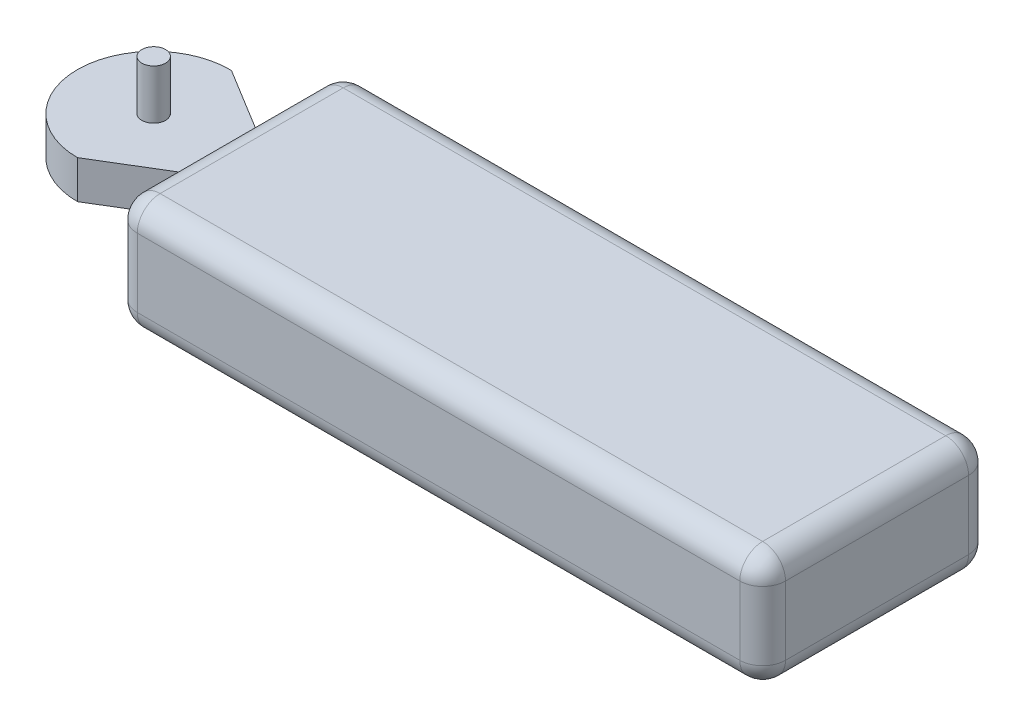
ISO-10303-21;
HEADER;
FILE_DESCRIPTION(('STEP AP214'),'2;1');
FILE_NAME('part.step','',(''),(''),'','','');
FILE_SCHEMA(('AUTOMOTIVE_DESIGN { 1 0 10303 214 1 1 1 1 }'));
ENDSEC;
DATA;
#1=APPLICATION_CONTEXT('core data for automotive mechanical design processes');
#2=APPLICATION_PROTOCOL_DEFINITION('international standard','automotive_design',2000,#1);
#3=PRODUCT_CONTEXT('',#1,'mechanical');
#4=PRODUCT('Part','Part','',(#3));
#5=PRODUCT_RELATED_PRODUCT_CATEGORY('part','',(#4));
#6=PRODUCT_DEFINITION_FORMATION('','',#4);
#7=PRODUCT_DEFINITION_CONTEXT('part definition',#1,'design');
#8=PRODUCT_DEFINITION('design','',#6,#7);
#9=PRODUCT_DEFINITION_SHAPE('','',#8);
#10=(LENGTH_UNIT() NAMED_UNIT(*) SI_UNIT(.MILLI.,.METRE.));
#11=(NAMED_UNIT(*) PLANE_ANGLE_UNIT() SI_UNIT($,.RADIAN.));
#12=(NAMED_UNIT(*) SI_UNIT($,.STERADIAN.) SOLID_ANGLE_UNIT());
#13=UNCERTAINTY_MEASURE_WITH_UNIT(LENGTH_MEASURE(1.E-05),#10,'distance_accuracy_value','');
#14=(GEOMETRIC_REPRESENTATION_CONTEXT(3) GLOBAL_UNCERTAINTY_ASSIGNED_CONTEXT((#13)) GLOBAL_UNIT_ASSIGNED_CONTEXT((#10,
#11,#12)) REPRESENTATION_CONTEXT('',''));
#15=CARTESIAN_POINT('',(0.,0.,0.));
#16=DIRECTION('',(0.,0.,1.));
#17=DIRECTION('',(1.,0.,0.));
#18=AXIS2_PLACEMENT_3D('',#15,#16,#17);
#19=CARTESIAN_POINT('',(0.,5.,0.));
#20=DIRECTION('',(0.,1.,0.));
#21=DIRECTION('',(0.,0.,1.));
#22=AXIS2_PLACEMENT_3D('',#19,#20,#21);
#23=PLANE('',#22);
#24=CARTESIAN_POINT('',(-5.69083513362976,5.,-2.99239543726236));
#25=DIRECTION('',(0.,1.,0.));
#26=DIRECTION('',(0.,0.,1.));
#27=AXIS2_PLACEMENT_3D('',#24,#25,#26);
#28=CIRCLE('',#27,1.55);
#29=CARTESIAN_POINT('',(-5.69083513362976,5.,-1.44239543726236));
#30=VERTEX_POINT('',#29);
#31=EDGE_CURVE('E328',#30,#30,#28,.T.);
#32=ORIENTED_EDGE('',*,*,#31,.F.);
#33=EDGE_LOOP('',(#32));
#34=FACE_BOUND('',#33,.T.);
#35=DIRECTION('',(0.,0.,-1.));
#36=VECTOR('',#35,1.);
#37=CARTESIAN_POINT('',(4.30916486637024,5.,-13.9923954372624));
#38=LINE('',#37,#36);
#39=CARTESIAN_POINT('',(4.30916486637024,5.,8.00760456273764));
#40=VERTEX_POINT('',#39);
#41=CARTESIAN_POINT('',(4.30916486637024,5.,-13.9923954372624));
#42=VERTEX_POINT('',#41);
#43=EDGE_CURVE('E338',#40,#42,#38,.T.);
#44=ORIENTED_EDGE('',*,*,#43,.T.);
#45=DIRECTION('',(-0.00427873727129613,0.,0.999990846161785));
#46=VECTOR('',#45,1.);
#47=CARTESIAN_POINT('',(4.24921674010145,5.,0.0181814484697253));
#48=LINE('',#47,#46);
#49=CARTESIAN_POINT('',(4.27929159000259,5.,-7.0106620382737));
#50=VERTEX_POINT('',#49);
#51=EDGE_CURVE('E182',#42,#50,#48,.T.);
#52=ORIENTED_EDGE('',*,*,#51,.T.);
#53=DIRECTION('',(0.853145713135539,0.,0.521672686805101));
#54=VECTOR('',#53,1.);
#55=CARTESIAN_POINT('',(4.28476164168329,5.,-7.00731726783965));
#56=LINE('',#55,#54);
#57=CARTESIAN_POINT('',(-5.50029135492208,5.,-12.9905799258781));
#58=VERTEX_POINT('',#57);
#59=EDGE_CURVE('E190',#58,#50,#56,.T.);
#60=ORIENTED_EDGE('',*,*,#59,.F.);
#61=CARTESIAN_POINT('',(-5.69083513362976,5.,-2.99239543726236));
#62=DIRECTION('',(0.,1.,0.));
#63=DIRECTION('',(0.,0.,1.));
#64=AXIS2_PLACEMENT_3D('',#61,#62,#63);
#65=CIRCLE('',#64,10.);
#66=CARTESIAN_POINT('',(-5.69083513362976,5.,7.00760456273764));
#67=VERTEX_POINT('',#66);
#68=EDGE_CURVE('E353',#58,#67,#65,.T.);
#69=ORIENTED_EDGE('',*,*,#68,.T.);
#70=DIRECTION('',(0.855333889667035,0.,-0.518077153701127));
#71=VECTOR('',#70,1.);
#72=CARTESIAN_POINT('',(1.57782987528949,5.,2.60496212740307));
#73=LINE('',#72,#71);
#74=CARTESIAN_POINT('',(4.21503178472273,5.,1.00760456273764));
#75=VERTEX_POINT('',#74);
#76=EDGE_CURVE('E356',#67,#75,#73,.T.);
#77=ORIENTED_EDGE('',*,*,#76,.T.);
#78=DIRECTION('',(0.,0.,1.));
#79=VECTOR('',#78,1.);
#80=CARTESIAN_POINT('',(4.21503178472273,5.,0.));
#81=LINE('',#80,#79);
#82=CARTESIAN_POINT('',(4.21503178472273,5.,8.00760456273764));
#83=VERTEX_POINT('',#82);
#84=EDGE_CURVE('E359',#75,#83,#81,.T.);
#85=ORIENTED_EDGE('',*,*,#84,.T.);
#86=DIRECTION('',(1.,0.,0.));
#87=VECTOR('',#86,1.);
#88=CARTESIAN_POINT('',(-15.6908351336298,5.,8.00760456273764));
#89=LINE('',#88,#87);
#90=EDGE_CURVE('E341',#83,#40,#89,.T.);
#91=ORIENTED_EDGE('',*,*,#90,.T.);
#92=EDGE_LOOP('',(#44,#52,#60,#69,#77,#85,#91));
#93=FACE_BOUND('',#92,.T.);
#94=ADVANCED_FACE('F39',(#34,#93),#23,.T.);
#95=CARTESIAN_POINT('',(0.,0.,0.));
#96=DIRECTION('',(0.,1.,0.));
#97=DIRECTION('',(0.,0.,1.));
#98=AXIS2_PLACEMENT_3D('',#95,#96,#97);
#99=PLANE('',#98);
#100=CARTESIAN_POINT('',(-5.69083513362976,0.,-2.99239543726236));
#101=DIRECTION('',(0.,1.,0.));
#102=DIRECTION('',(0.,0.,1.));
#103=AXIS2_PLACEMENT_3D('',#100,#101,#102);
#104=CIRCLE('',#103,1.55);
#105=CARTESIAN_POINT('',(-5.69083513362976,0.,-1.44239543726236));
#106=VERTEX_POINT('',#105);
#107=EDGE_CURVE('E329',#106,#106,#104,.T.);
#108=ORIENTED_EDGE('',*,*,#107,.T.);
#109=EDGE_LOOP('',(#108));
#110=FACE_BOUND('',#109,.T.);
#111=DIRECTION('',(-0.00427873727129613,0.,0.999990846161785));
#112=VECTOR('',#111,1.);
#113=CARTESIAN_POINT('',(4.24921674010145,0.,0.0181814484697253));
#114=LINE('',#113,#112);
#115=CARTESIAN_POINT('',(4.30916486637024,0.,-13.9923954372624));
#116=VERTEX_POINT('',#115);
#117=CARTESIAN_POINT('',(4.27929159000259,0.,-7.0106620382737));
#118=VERTEX_POINT('',#117);
#119=EDGE_CURVE('E172',#116,#118,#114,.T.);
#120=ORIENTED_EDGE('',*,*,#119,.F.);
#121=DIRECTION('',(0.,0.,-1.));
#122=VECTOR('',#121,1.);
#123=CARTESIAN_POINT('',(4.30916486637024,0.,-13.9923954372624));
#124=LINE('',#123,#122);
#125=CARTESIAN_POINT('',(4.30916486637024,0.,8.00760456273764));
#126=VERTEX_POINT('',#125);
#127=EDGE_CURVE('E339',#126,#116,#124,.T.);
#128=ORIENTED_EDGE('',*,*,#127,.F.);
#129=DIRECTION('',(1.,0.,0.));
#130=VECTOR('',#129,1.);
#131=CARTESIAN_POINT('',(-15.6908351336298,0.,8.00760456273764));
#132=LINE('',#131,#130);
#133=CARTESIAN_POINT('',(4.21503178472273,0.,8.00760456273764));
#134=VERTEX_POINT('',#133);
#135=EDGE_CURVE('E332',#134,#126,#132,.T.);
#136=ORIENTED_EDGE('',*,*,#135,.F.);
#137=DIRECTION('',(0.,0.,1.));
#138=VECTOR('',#137,1.);
#139=CARTESIAN_POINT('',(4.21503178472273,0.,0.));
#140=LINE('',#139,#138);
#141=CARTESIAN_POINT('',(4.21503178472273,0.,1.00760456273764));
#142=VERTEX_POINT('',#141);
#143=EDGE_CURVE('E200',#142,#134,#140,.T.);
#144=ORIENTED_EDGE('',*,*,#143,.F.);
#145=DIRECTION('',(0.855333889667035,0.,-0.518077153701127));
#146=VECTOR('',#145,1.);
#147=CARTESIAN_POINT('',(1.57782987528949,0.,2.60496212740307));
#148=LINE('',#147,#146);
#149=CARTESIAN_POINT('',(-5.69083513362976,0.,7.00760456273764));
#150=VERTEX_POINT('',#149);
#151=EDGE_CURVE('E196',#150,#142,#148,.T.);
#152=ORIENTED_EDGE('',*,*,#151,.F.);
#153=CARTESIAN_POINT('',(-5.69083513362976,0.,-2.99239543726236));
#154=DIRECTION('',(0.,1.,0.));
#155=DIRECTION('',(0.,0.,1.));
#156=AXIS2_PLACEMENT_3D('',#153,#154,#155);
#157=CIRCLE('',#156,10.);
#158=CARTESIAN_POINT('',(-5.50029135492208,0.,-12.9905799258781));
#159=VERTEX_POINT('',#158);
#160=EDGE_CURVE('E47',#159,#150,#157,.T.);
#161=ORIENTED_EDGE('',*,*,#160,.F.);
#162=DIRECTION('',(0.853145713135539,0.,0.521672686805101));
#163=VECTOR('',#162,1.);
#164=CARTESIAN_POINT('',(4.28476164168329,0.,-7.00731726783965));
#165=LINE('',#164,#163);
#166=EDGE_CURVE('E11',#159,#118,#165,.T.);
#167=ORIENTED_EDGE('',*,*,#166,.T.);
#168=EDGE_LOOP('',(#120,#128,#136,#144,#152,#161,#167));
#169=FACE_BOUND('',#168,.T.);
#170=ADVANCED_FACE('F193',(#110,#169),#99,.F.);
#171=CARTESIAN_POINT('',(-15.6908351336298,5.,8.00760456273764));
#172=DIRECTION('',(0.,0.,-1.));
#173=DIRECTION('',(-1.,0.,0.));
#174=AXIS2_PLACEMENT_3D('',#171,#172,#173);
#175=PLANE('',#174);
#176=DIRECTION('',(0.,1.,0.));
#177=VECTOR('',#176,1.);
#178=CARTESIAN_POINT('',(4.21503178472273,-8.5,8.00760456273764));
#179=LINE('',#178,#177);
#180=EDGE_CURVE('E363',#134,#83,#179,.T.);
#181=ORIENTED_EDGE('',*,*,#180,.F.);
#182=ORIENTED_EDGE('',*,*,#135,.T.);
#183=DIRECTION('',(0.,-1.,0.));
#184=VECTOR('',#183,1.);
#185=CARTESIAN_POINT('',(4.30916486637024,5.,8.00760456273764));
#186=LINE('',#185,#184);
#187=EDGE_CURVE('E334',#40,#126,#186,.T.);
#188=ORIENTED_EDGE('',*,*,#187,.F.);
#189=ORIENTED_EDGE('',*,*,#90,.F.);
#190=EDGE_LOOP('',(#181,#182,#188,#189));
#191=FACE_BOUND('',#190,.T.);
#192=ADVANCED_FACE('F379',(#191),#175,.F.);
#193=CARTESIAN_POINT('',(7.30916486637024,0.,9.16296612584685));
#194=DIRECTION('',(0.,1.,0.));
#195=DIRECTION('',(0.,0.,1.));
#196=AXIS2_PLACEMENT_3D('',#193,#194,#195);
#197=CYLINDRICAL_SURFACE('',#196,3.);
#198=CARTESIAN_POINT('',(7.30916486637023,5.5,9.16296612584685));
#199=DIRECTION('',(0.,1.,0.));
#200=DIRECTION('',(0.,0.,1.));
#201=AXIS2_PLACEMENT_3D('',#198,#199,#200);
#202=CIRCLE('',#201,3.);
#203=CARTESIAN_POINT('',(4.30916486637024,5.5,9.16296612584685));
#204=VERTEX_POINT('',#203);
#205=CARTESIAN_POINT('',(7.30916486637023,5.5,12.1629661258468));
#206=VERTEX_POINT('',#205);
#207=EDGE_CURVE('E204',#204,#206,#202,.T.);
#208=ORIENTED_EDGE('',*,*,#207,.F.);
#209=DIRECTION('',(0.,1.,0.));
#210=VECTOR('',#209,1.);
#211=CARTESIAN_POINT('',(4.30916486637024,0.,9.16296612584685));
#212=LINE('',#211,#210);
#213=CARTESIAN_POINT('',(4.30916486637024,-3.5,9.16296612584684));
#214=VERTEX_POINT('',#213);
#215=EDGE_CURVE('E246',#214,#204,#212,.T.);
#216=ORIENTED_EDGE('',*,*,#215,.F.);
#217=CARTESIAN_POINT('',(7.30916486637023,-3.5,9.16296612584684));
#218=DIRECTION('',(0.,1.,0.));
#219=DIRECTION('',(0.,0.,1.));
#220=AXIS2_PLACEMENT_3D('',#217,#218,#219);
#221=CIRCLE('',#220,3.);
#222=CARTESIAN_POINT('',(7.30916486637023,-3.5,12.1629661258468));
#223=VERTEX_POINT('',#222);
#224=EDGE_CURVE('E62',#214,#223,#221,.T.);
#225=ORIENTED_EDGE('',*,*,#224,.T.);
#226=DIRECTION('',(0.,1.,0.));
#227=VECTOR('',#226,1.);
#228=CARTESIAN_POINT('',(7.30916486637025,8.5,12.1629661258468));
#229=LINE('',#228,#227);
#230=EDGE_CURVE('E219',#206,#223,#229,.F.);
#231=ORIENTED_EDGE('',*,*,#230,.F.);
#232=EDGE_LOOP('',(#208,#216,#225,#231));
#233=FACE_BOUND('',#232,.T.);
#234=ADVANCED_FACE('F41',(#233),#197,.T.);
#235=CARTESIAN_POINT('',(7.30916486637025,-3.5,9.16296612584685));
#236=DIRECTION('',(1.,0.,0.));
#237=DIRECTION('',(0.,0.,-1.));
#238=AXIS2_PLACEMENT_3D('',#235,#236,#237);
#239=SPHERICAL_SURFACE('',#238,3.);
#240=ORIENTED_EDGE('',*,*,#224,.F.);
#241=CARTESIAN_POINT('',(7.30916486637023,-3.5,9.16296612584685));
#242=DIRECTION('',(0.,0.,1.));
#243=DIRECTION('',(1.,0.,0.));
#244=AXIS2_PLACEMENT_3D('',#241,#242,#243);
#245=CIRCLE('',#244,3.);
#246=CARTESIAN_POINT('',(7.30916486637023,-6.5,9.16296612584685));
#247=VERTEX_POINT('',#246);
#248=EDGE_CURVE('E207',#214,#247,#245,.T.);
#249=ORIENTED_EDGE('',*,*,#248,.T.);
#250=CARTESIAN_POINT('',(7.30916486637025,-3.5,9.16296612584685));
#251=DIRECTION('',(1.,0.,0.));
#252=DIRECTION('',(0.,0.,-1.));
#253=AXIS2_PLACEMENT_3D('',#250,#251,#252);
#254=CIRCLE('',#253,3.);
#255=EDGE_CURVE('E221',#223,#247,#254,.T.);
#256=ORIENTED_EDGE('',*,*,#255,.F.);
#257=EDGE_LOOP('',(#240,#249,#256));
#258=FACE_BOUND('',#257,.T.);
#259=ADVANCED_FACE('F485',(#258),#239,.T.);
#260=CARTESIAN_POINT('',(7.30916486637024,-3.5,0.));
#261=DIRECTION('',(0.,0.,1.));
#262=DIRECTION('',(1.,0.,0.));
#263=AXIS2_PLACEMENT_3D('',#260,#261,#262);
#264=CYLINDRICAL_SURFACE('',#263,3.);
#265=ORIENTED_EDGE('',*,*,#248,.F.);
#266=DIRECTION('',(0.,0.,1.));
#267=VECTOR('',#266,1.);
#268=CARTESIAN_POINT('',(4.30916486637024,-3.5,0.));
#269=LINE('',#268,#267);
#270=CARTESIAN_POINT('',(4.30916486637024,-3.5,-14.8370338741532));
#271=VERTEX_POINT('',#270);
#272=EDGE_CURVE('E244',#271,#214,#269,.T.);
#273=ORIENTED_EDGE('',*,*,#272,.F.);
#274=CARTESIAN_POINT('',(7.30916486637023,-3.5,-14.8370338741532));
#275=DIRECTION('',(0.,0.,1.));
#276=DIRECTION('',(1.,0.,0.));
#277=AXIS2_PLACEMENT_3D('',#274,#275,#276);
#278=CIRCLE('',#277,3.);
#279=CARTESIAN_POINT('',(7.30916486637023,-6.5,-14.8370338741532));
#280=VERTEX_POINT('',#279);
#281=EDGE_CURVE('E209',#271,#280,#278,.T.);
#282=ORIENTED_EDGE('',*,*,#281,.T.);
#283=DIRECTION('',(0.,0.,1.));
#284=VECTOR('',#283,1.);
#285=CARTESIAN_POINT('',(7.30916486637025,-6.5,12.1629661258468));
#286=LINE('',#285,#284);
#287=EDGE_CURVE('E224',#247,#280,#286,.F.);
#288=ORIENTED_EDGE('',*,*,#287,.F.);
#289=EDGE_LOOP('',(#265,#273,#282,#288));
#290=FACE_BOUND('',#289,.T.);
#291=ADVANCED_FACE('F482',(#290),#264,.T.);
#292=CARTESIAN_POINT('',(7.30916486637025,-3.5,-14.8370338741532));
#293=DIRECTION('',(1.,0.,0.));
#294=DIRECTION('',(0.,0.,-1.));
#295=AXIS2_PLACEMENT_3D('',#292,#293,#294);
#296=SPHERICAL_SURFACE('',#295,3.);
#297=ORIENTED_EDGE('',*,*,#281,.F.);
#298=CARTESIAN_POINT('',(7.30916486637023,-3.5,-14.8370338741532));
#299=DIRECTION('',(0.,-1.,0.));
#300=DIRECTION('',(0.,0.,-1.));
#301=AXIS2_PLACEMENT_3D('',#298,#299,#300);
#302=CIRCLE('',#301,3.);
#303=CARTESIAN_POINT('',(7.30916486637023,-3.5,-17.8370338741532));
#304=VERTEX_POINT('',#303);
#305=EDGE_CURVE('E211',#271,#304,#302,.T.);
#306=ORIENTED_EDGE('',*,*,#305,.T.);
#307=CARTESIAN_POINT('',(7.30916486637025,-3.5,-14.8370338741532));
#308=DIRECTION('',(1.,0.,0.));
#309=DIRECTION('',(0.,0.,-1.));
#310=AXIS2_PLACEMENT_3D('',#307,#308,#309);
#311=CIRCLE('',#310,3.);
#312=EDGE_CURVE('E227',#280,#304,#311,.T.);
#313=ORIENTED_EDGE('',*,*,#312,.F.);
#314=EDGE_LOOP('',(#297,#306,#313));
#315=FACE_BOUND('',#314,.T.);
#316=ADVANCED_FACE('F478',(#315),#296,.T.);
#317=CARTESIAN_POINT('',(7.30916486637024,0.,-14.8370338741532));
#318=DIRECTION('',(0.,-1.,0.));
#319=DIRECTION('',(0.,0.,-1.));
#320=AXIS2_PLACEMENT_3D('',#317,#318,#319);
#321=CYLINDRICAL_SURFACE('',#320,3.);
#322=ORIENTED_EDGE('',*,*,#305,.F.);
#323=DIRECTION('',(0.,-1.,0.));
#324=VECTOR('',#323,1.);
#325=CARTESIAN_POINT('',(4.30916486637024,0.,-14.8370338741532));
#326=LINE('',#325,#324);
#327=CARTESIAN_POINT('',(4.30916486637024,5.5,-14.8370338741532));
#328=VERTEX_POINT('',#327);
#329=EDGE_CURVE('E241',#328,#271,#326,.T.);
#330=ORIENTED_EDGE('',*,*,#329,.F.);
#331=CARTESIAN_POINT('',(7.30916486637023,5.5,-14.8370338741532));
#332=DIRECTION('',(0.,-1.,0.));
#333=DIRECTION('',(0.,0.,-1.));
#334=AXIS2_PLACEMENT_3D('',#331,#332,#333);
#335=CIRCLE('',#334,3.);
#336=CARTESIAN_POINT('',(7.30916486637023,5.5,-17.8370338741531));
#337=VERTEX_POINT('',#336);
#338=EDGE_CURVE('E213',#328,#337,#335,.T.);
#339=ORIENTED_EDGE('',*,*,#338,.T.);
#340=DIRECTION('',(0.,-1.,0.));
#341=VECTOR('',#340,1.);
#342=CARTESIAN_POINT('',(7.30916486637025,8.5,-17.8370338741531));
#343=LINE('',#342,#341);
#344=EDGE_CURVE('E230',#304,#337,#343,.F.);
#345=ORIENTED_EDGE('',*,*,#344,.F.);
#346=EDGE_LOOP('',(#322,#330,#339,#345));
#347=FACE_BOUND('',#346,.T.);
#348=ADVANCED_FACE('F474',(#347),#321,.T.);
#349=CARTESIAN_POINT('',(7.30916486637025,5.5,-14.8370338741532));
#350=DIRECTION('',(1.,0.,0.));
#351=DIRECTION('',(0.,0.,-1.));
#352=AXIS2_PLACEMENT_3D('',#349,#350,#351);
#353=SPHERICAL_SURFACE('',#352,3.);
#354=ORIENTED_EDGE('',*,*,#338,.F.);
#355=CARTESIAN_POINT('',(7.30916486637023,5.5,-14.8370338741532));
#356=DIRECTION('',(0.,0.,-1.));
#357=DIRECTION('',(-1.,0.,0.));
#358=AXIS2_PLACEMENT_3D('',#355,#356,#357);
#359=CIRCLE('',#358,3.);
#360=CARTESIAN_POINT('',(7.30916486637023,8.5,-14.8370338741532));
#361=VERTEX_POINT('',#360);
#362=EDGE_CURVE('E215',#328,#361,#359,.T.);
#363=ORIENTED_EDGE('',*,*,#362,.T.);
#364=CARTESIAN_POINT('',(7.30916486637025,5.5,-14.8370338741532));
#365=DIRECTION('',(-1.,0.,0.));
#366=DIRECTION('',(0.,0.,1.));
#367=AXIS2_PLACEMENT_3D('',#364,#365,#366);
#368=CIRCLE('',#367,3.);
#369=EDGE_CURVE('E233',#337,#361,#368,.F.);
#370=ORIENTED_EDGE('',*,*,#369,.F.);
#371=EDGE_LOOP('',(#354,#363,#370));
#372=FACE_BOUND('',#371,.T.);
#373=ADVANCED_FACE('F470',(#372),#353,.T.);
#374=CARTESIAN_POINT('',(7.30916486637024,5.5,0.));
#375=DIRECTION('',(0.,0.,-1.));
#376=DIRECTION('',(0.,1.,0.));
#377=AXIS2_PLACEMENT_3D('',#374,#375,#376);
#378=CYLINDRICAL_SURFACE('',#377,3.);
#379=ORIENTED_EDGE('',*,*,#362,.F.);
#380=DIRECTION('',(0.,0.,-1.));
#381=VECTOR('',#380,1.);
#382=CARTESIAN_POINT('',(4.30916486637024,5.5,0.));
#383=LINE('',#382,#381);
#384=EDGE_CURVE('E239',#204,#328,#383,.T.);
#385=ORIENTED_EDGE('',*,*,#384,.F.);
#386=CARTESIAN_POINT('',(7.30916486637023,5.5,9.16296612584685));
#387=DIRECTION('',(0.,0.,-1.));
#388=DIRECTION('',(-1.,0.,0.));
#389=AXIS2_PLACEMENT_3D('',#386,#387,#388);
#390=CIRCLE('',#389,3.);
#391=CARTESIAN_POINT('',(7.30916486637023,8.5,9.16296612584685));
#392=VERTEX_POINT('',#391);
#393=EDGE_CURVE('E217',#204,#392,#390,.T.);
#394=ORIENTED_EDGE('',*,*,#393,.T.);
#395=DIRECTION('',(0.,0.,-1.));
#396=VECTOR('',#395,1.);
#397=CARTESIAN_POINT('',(7.30916486637025,8.5,12.1629661258468));
#398=LINE('',#397,#396);
#399=EDGE_CURVE('E236',#361,#392,#398,.F.);
#400=ORIENTED_EDGE('',*,*,#399,.F.);
#401=EDGE_LOOP('',(#379,#385,#394,#400));
#402=FACE_BOUND('',#401,.T.);
#403=ADVANCED_FACE('F466',(#402),#378,.T.);
#404=CARTESIAN_POINT('',(7.30916486637025,5.5,9.16296612584685));
#405=DIRECTION('',(1.,0.,0.));
#406=DIRECTION('',(0.,0.,-1.));
#407=AXIS2_PLACEMENT_3D('',#404,#405,#406);
#408=SPHERICAL_SURFACE('',#407,3.);
#409=ORIENTED_EDGE('',*,*,#393,.F.);
#410=ORIENTED_EDGE('',*,*,#207,.T.);
#411=CARTESIAN_POINT('',(7.30916486637025,5.5,9.16296612584685));
#412=DIRECTION('',(-1.,0.,0.));
#413=DIRECTION('',(0.,0.,1.));
#414=AXIS2_PLACEMENT_3D('',#411,#412,#413);
#415=CIRCLE('',#414,3.);
#416=EDGE_CURVE('E249',#392,#206,#415,.F.);
#417=ORIENTED_EDGE('',*,*,#416,.F.);
#418=EDGE_LOOP('',(#409,#410,#417));
#419=FACE_BOUND('',#418,.T.);
#420=ADVANCED_FACE('F462',(#419),#408,.T.);
#421=CARTESIAN_POINT('',(86.3091648663703,-3.5,0.));
#422=DIRECTION('',(0.,0.,1.));
#423=DIRECTION('',(1.,0.,0.));
#424=AXIS2_PLACEMENT_3D('',#421,#422,#423);
#425=CYLINDRICAL_SURFACE('',#424,3.);
#426=CARTESIAN_POINT('',(86.3091648663703,-3.5,-14.8370338741532));
#427=DIRECTION('',(0.,0.,-1.));
#428=DIRECTION('',(-1.,0.,0.));
#429=AXIS2_PLACEMENT_3D('',#426,#427,#428);
#430=CIRCLE('',#429,3.);
#431=CARTESIAN_POINT('',(89.3091648663703,-3.5,-14.8370338741532));
#432=VERTEX_POINT('',#431);
#433=CARTESIAN_POINT('',(86.3091648663703,-6.5,-14.8370338741532));
#434=VERTEX_POINT('',#433);
#435=EDGE_CURVE('E252',#432,#434,#430,.T.);
#436=ORIENTED_EDGE('',*,*,#435,.F.);
#437=DIRECTION('',(0.,0.,-1.));
#438=VECTOR('',#437,1.);
#439=CARTESIAN_POINT('',(89.3091648663703,-3.5,0.));
#440=LINE('',#439,#438);
#441=CARTESIAN_POINT('',(89.3091648663703,-3.5,9.16296612584685));
#442=VERTEX_POINT('',#441);
#443=EDGE_CURVE('E302',#442,#432,#440,.T.);
#444=ORIENTED_EDGE('',*,*,#443,.F.);
#445=CARTESIAN_POINT('',(86.3091648663703,-3.5,9.16296612584685));
#446=DIRECTION('',(0.,0.,-1.));
#447=DIRECTION('',(-1.,0.,0.));
#448=AXIS2_PLACEMENT_3D('',#445,#446,#447);
#449=CIRCLE('',#448,3.);
#450=CARTESIAN_POINT('',(86.3091648663703,-6.5,9.16296612584685));
#451=VERTEX_POINT('',#450);
#452=EDGE_CURVE('E255',#442,#451,#449,.T.);
#453=ORIENTED_EDGE('',*,*,#452,.T.);
#454=DIRECTION('',(0.,0.,-1.));
#455=VECTOR('',#454,1.);
#456=CARTESIAN_POINT('',(86.3091648663703,-6.5,0.));
#457=LINE('',#456,#455);
#458=EDGE_CURVE('E272',#434,#451,#457,.F.);
#459=ORIENTED_EDGE('',*,*,#458,.F.);
#460=EDGE_LOOP('',(#436,#444,#453,#459));
#461=FACE_BOUND('',#460,.T.);
#462=ADVANCED_FACE('F458',(#461),#425,.T.);
#463=CARTESIAN_POINT('',(86.3091648663703,-3.5,9.16296612584685));
#464=DIRECTION('',(1.,0.,0.));
#465=DIRECTION('',(0.,0.,-1.));
#466=AXIS2_PLACEMENT_3D('',#463,#464,#465);
#467=SPHERICAL_SURFACE('',#466,3.);
#468=ORIENTED_EDGE('',*,*,#452,.F.);
#469=CARTESIAN_POINT('',(86.3091648663703,-3.5,9.16296612584684));
#470=DIRECTION('',(0.,-1.,0.));
#471=DIRECTION('',(0.,0.,-1.));
#472=AXIS2_PLACEMENT_3D('',#469,#470,#471);
#473=CIRCLE('',#472,3.);
#474=CARTESIAN_POINT('',(86.3091648663703,-3.5,12.1629661258468));
#475=VERTEX_POINT('',#474);
#476=EDGE_CURVE('E257',#442,#475,#473,.T.);
#477=ORIENTED_EDGE('',*,*,#476,.T.);
#478=CARTESIAN_POINT('',(86.3091648663703,-3.5,9.16296612584685));
#479=DIRECTION('',(1.,0.,0.));
#480=DIRECTION('',(0.,0.,-1.));
#481=AXIS2_PLACEMENT_3D('',#478,#479,#480);
#482=CIRCLE('',#481,3.);
#483=EDGE_CURVE('E275',#451,#475,#482,.F.);
#484=ORIENTED_EDGE('',*,*,#483,.F.);
#485=EDGE_LOOP('',(#468,#477,#484));
#486=FACE_BOUND('',#485,.T.);
#487=ADVANCED_FACE('F454',(#486),#467,.T.);
#488=CARTESIAN_POINT('',(86.3091648663703,0.,9.16296612584685));
#489=DIRECTION('',(0.,1.,0.));
#490=DIRECTION('',(0.,0.,1.));
#491=AXIS2_PLACEMENT_3D('',#488,#489,#490);
#492=CYLINDRICAL_SURFACE('',#491,3.);
#493=ORIENTED_EDGE('',*,*,#476,.F.);
#494=DIRECTION('',(0.,-1.,0.));
#495=VECTOR('',#494,1.);
#496=CARTESIAN_POINT('',(89.3091648663703,0.,9.16296612584685));
#497=LINE('',#496,#495);
#498=CARTESIAN_POINT('',(89.3091648663703,5.5,9.16296612584685));
#499=VERTEX_POINT('',#498);
#500=EDGE_CURVE('E299',#499,#442,#497,.T.);
#501=ORIENTED_EDGE('',*,*,#500,.F.);
#502=CARTESIAN_POINT('',(86.3091648663703,5.5,9.16296612584685));
#503=DIRECTION('',(0.,-1.,0.));
#504=DIRECTION('',(0.,0.,-1.));
#505=AXIS2_PLACEMENT_3D('',#502,#503,#504);
#506=CIRCLE('',#505,3.);
#507=CARTESIAN_POINT('',(86.3091648663703,5.5,12.1629661258468));
#508=VERTEX_POINT('',#507);
#509=EDGE_CURVE('E260',#499,#508,#506,.T.);
#510=ORIENTED_EDGE('',*,*,#509,.T.);
#511=DIRECTION('',(0.,-1.,0.));
#512=VECTOR('',#511,1.);
#513=CARTESIAN_POINT('',(86.3091648663703,0.,12.1629661258468));
#514=LINE('',#513,#512);
#515=EDGE_CURVE('E278',#475,#508,#514,.F.);
#516=ORIENTED_EDGE('',*,*,#515,.F.);
#517=EDGE_LOOP('',(#493,#501,#510,#516));
#518=FACE_BOUND('',#517,.T.);
#519=ADVANCED_FACE('F450',(#518),#492,.T.);
#520=CARTESIAN_POINT('',(86.3091648663703,5.5,9.16296612584685));
#521=DIRECTION('',(1.,0.,0.));
#522=DIRECTION('',(0.,0.,-1.));
#523=AXIS2_PLACEMENT_3D('',#520,#521,#522);
#524=SPHERICAL_SURFACE('',#523,3.);
#525=ORIENTED_EDGE('',*,*,#509,.F.);
#526=CARTESIAN_POINT('',(86.3091648663703,5.5,9.16296612584685));
#527=DIRECTION('',(0.,0.,1.));
#528=DIRECTION('',(1.,0.,0.));
#529=AXIS2_PLACEMENT_3D('',#526,#527,#528);
#530=CIRCLE('',#529,3.);
#531=CARTESIAN_POINT('',(86.3091648663703,8.5,9.16296612584685));
#532=VERTEX_POINT('',#531);
#533=EDGE_CURVE('E262',#499,#532,#530,.T.);
#534=ORIENTED_EDGE('',*,*,#533,.T.);
#535=CARTESIAN_POINT('',(86.3091648663703,5.5,9.16296612584685));
#536=DIRECTION('',(-1.,0.,0.));
#537=DIRECTION('',(0.,0.,1.));
#538=AXIS2_PLACEMENT_3D('',#535,#536,#537);
#539=CIRCLE('',#538,3.);
#540=EDGE_CURVE('E281',#508,#532,#539,.T.);
#541=ORIENTED_EDGE('',*,*,#540,.F.);
#542=EDGE_LOOP('',(#525,#534,#541));
#543=FACE_BOUND('',#542,.T.);
#544=ADVANCED_FACE('F446',(#543),#524,.T.);
#545=CARTESIAN_POINT('',(86.3091648663703,5.5,0.));
#546=DIRECTION('',(0.,0.,-1.));
#547=DIRECTION('',(0.,1.,0.));
#548=AXIS2_PLACEMENT_3D('',#545,#546,#547);
#549=CYLINDRICAL_SURFACE('',#548,3.);
#550=ORIENTED_EDGE('',*,*,#533,.F.);
#551=DIRECTION('',(0.,0.,1.));
#552=VECTOR('',#551,1.);
#553=CARTESIAN_POINT('',(89.3091648663703,5.5,0.));
#554=LINE('',#553,#552);
#555=CARTESIAN_POINT('',(89.3091648663703,5.5,-14.8370338741532));
#556=VERTEX_POINT('',#555);
#557=EDGE_CURVE('E296',#556,#499,#554,.T.);
#558=ORIENTED_EDGE('',*,*,#557,.F.);
#559=CARTESIAN_POINT('',(86.3091648663703,5.5,-14.8370338741532));
#560=DIRECTION('',(0.,0.,1.));
#561=DIRECTION('',(1.,0.,0.));
#562=AXIS2_PLACEMENT_3D('',#559,#560,#561);
#563=CIRCLE('',#562,3.);
#564=CARTESIAN_POINT('',(86.3091648663703,8.5,-14.8370338741532));
#565=VERTEX_POINT('',#564);
#566=EDGE_CURVE('E265',#556,#565,#563,.T.);
#567=ORIENTED_EDGE('',*,*,#566,.T.);
#568=DIRECTION('',(0.,0.,1.));
#569=VECTOR('',#568,1.);
#570=CARTESIAN_POINT('',(86.3091648663703,8.5,0.));
#571=LINE('',#570,#569);
#572=EDGE_CURVE('E284',#532,#565,#571,.F.);
#573=ORIENTED_EDGE('',*,*,#572,.F.);
#574=EDGE_LOOP('',(#550,#558,#567,#573));
#575=FACE_BOUND('',#574,.T.);
#576=ADVANCED_FACE('F442',(#575),#549,.T.);
#577=CARTESIAN_POINT('',(86.3091648663703,5.5,-14.8370338741532));
#578=DIRECTION('',(1.,0.,0.));
#579=DIRECTION('',(0.,0.,-1.));
#580=AXIS2_PLACEMENT_3D('',#577,#578,#579);
#581=SPHERICAL_SURFACE('',#580,3.);
#582=ORIENTED_EDGE('',*,*,#566,.F.);
#583=CARTESIAN_POINT('',(86.3091648663703,5.5,-14.8370338741532));
#584=DIRECTION('',(0.,1.,0.));
#585=DIRECTION('',(0.,0.,1.));
#586=AXIS2_PLACEMENT_3D('',#583,#584,#585);
#587=CIRCLE('',#586,3.);
#588=CARTESIAN_POINT('',(86.3091648663703,5.5,-17.8370338741531));
#589=VERTEX_POINT('',#588);
#590=EDGE_CURVE('E267',#556,#589,#587,.T.);
#591=ORIENTED_EDGE('',*,*,#590,.T.);
#592=CARTESIAN_POINT('',(86.3091648663703,5.5,-14.8370338741532));
#593=DIRECTION('',(-1.,0.,0.));
#594=DIRECTION('',(0.,0.,1.));
#595=AXIS2_PLACEMENT_3D('',#592,#593,#594);
#596=CIRCLE('',#595,3.);
#597=EDGE_CURVE('E287',#565,#589,#596,.T.);
#598=ORIENTED_EDGE('',*,*,#597,.F.);
#599=EDGE_LOOP('',(#582,#591,#598));
#600=FACE_BOUND('',#599,.T.);
#601=ADVANCED_FACE('F438',(#600),#581,.T.);
#602=CARTESIAN_POINT('',(86.3091648663703,0.,-14.8370338741532));
#603=DIRECTION('',(0.,-1.,0.));
#604=DIRECTION('',(0.,0.,-1.));
#605=AXIS2_PLACEMENT_3D('',#602,#603,#604);
#606=CYLINDRICAL_SURFACE('',#605,3.);
#607=ORIENTED_EDGE('',*,*,#590,.F.);
#608=DIRECTION('',(0.,1.,0.));
#609=VECTOR('',#608,1.);
#610=CARTESIAN_POINT('',(89.3091648663703,0.,-14.8370338741532));
#611=LINE('',#610,#609);
#612=EDGE_CURVE('E293',#432,#556,#611,.T.);
#613=ORIENTED_EDGE('',*,*,#612,.F.);
#614=CARTESIAN_POINT('',(86.3091648663703,-3.5,-14.8370338741532));
#615=DIRECTION('',(0.,1.,0.));
#616=DIRECTION('',(0.,0.,1.));
#617=AXIS2_PLACEMENT_3D('',#614,#615,#616);
#618=CIRCLE('',#617,3.);
#619=CARTESIAN_POINT('',(86.3091648663703,-3.5,-17.8370338741532));
#620=VERTEX_POINT('',#619);
#621=EDGE_CURVE('E270',#432,#620,#618,.T.);
#622=ORIENTED_EDGE('',*,*,#621,.T.);
#623=DIRECTION('',(0.,1.,0.));
#624=VECTOR('',#623,1.);
#625=CARTESIAN_POINT('',(86.3091648663703,0.,-17.8370338741532));
#626=LINE('',#625,#624);
#627=EDGE_CURVE('E290',#589,#620,#626,.F.);
#628=ORIENTED_EDGE('',*,*,#627,.F.);
#629=EDGE_LOOP('',(#607,#613,#622,#628));
#630=FACE_BOUND('',#629,.T.);
#631=ADVANCED_FACE('F434',(#630),#606,.T.);
#632=CARTESIAN_POINT('',(86.3091648663703,-3.5,-14.8370338741532));
#633=DIRECTION('',(1.,0.,0.));
#634=DIRECTION('',(0.,0.,-1.));
#635=AXIS2_PLACEMENT_3D('',#632,#633,#634);
#636=SPHERICAL_SURFACE('',#635,3.);
#637=ORIENTED_EDGE('',*,*,#621,.F.);
#638=ORIENTED_EDGE('',*,*,#435,.T.);
#639=CARTESIAN_POINT('',(86.3091648663703,-3.5,-14.8370338741532));
#640=DIRECTION('',(1.,0.,0.));
#641=DIRECTION('',(0.,0.,-1.));
#642=AXIS2_PLACEMENT_3D('',#639,#640,#641);
#643=CIRCLE('',#642,3.);
#644=EDGE_CURVE('E305',#620,#434,#643,.F.);
#645=ORIENTED_EDGE('',*,*,#644,.F.);
#646=EDGE_LOOP('',(#637,#638,#645));
#647=FACE_BOUND('',#646,.T.);
#648=ADVANCED_FACE('F430',(#647),#636,.T.);
#649=CARTESIAN_POINT('',(89.3091648663703,-3.5,-14.8370338741532));
#650=DIRECTION('',(1.,0.,0.));
#651=DIRECTION('',(0.,0.,-1.));
#652=AXIS2_PLACEMENT_3D('',#649,#650,#651);
#653=CYLINDRICAL_SURFACE('',#652,3.);
#654=DIRECTION('',(1.,0.,0.));
#655=VECTOR('',#654,1.);
#656=CARTESIAN_POINT('',(89.3091648663703,-6.5,-14.8370338741532));
#657=LINE('',#656,#655);
#658=EDGE_CURVE('E311',#280,#434,#657,.T.);
#659=ORIENTED_EDGE('',*,*,#658,.F.);
#660=ORIENTED_EDGE('',*,*,#312,.T.);
#661=DIRECTION('',(1.,0.,0.));
#662=VECTOR('',#661,1.);
#663=CARTESIAN_POINT('',(89.3091648663703,-3.5,-17.8370338741532));
#664=LINE('',#663,#662);
#665=EDGE_CURVE('E308',#620,#304,#664,.F.);
#666=ORIENTED_EDGE('',*,*,#665,.F.);
#667=ORIENTED_EDGE('',*,*,#644,.T.);
#668=EDGE_LOOP('',(#659,#660,#666,#667));
#669=FACE_BOUND('',#668,.T.);
#670=ADVANCED_FACE('F426',(#669),#653,.T.);
#671=CARTESIAN_POINT('',(89.3091648663703,5.5,-14.8370338741532));
#672=DIRECTION('',(-1.,0.,0.));
#673=DIRECTION('',(0.,0.,1.));
#674=AXIS2_PLACEMENT_3D('',#671,#672,#673);
#675=CYLINDRICAL_SURFACE('',#674,3.);
#676=DIRECTION('',(-1.,0.,0.));
#677=VECTOR('',#676,1.);
#678=CARTESIAN_POINT('',(89.3091648663703,5.5,-17.8370338741531));
#679=LINE('',#678,#677);
#680=EDGE_CURVE('E313',#337,#589,#679,.F.);
#681=ORIENTED_EDGE('',*,*,#680,.F.);
#682=ORIENTED_EDGE('',*,*,#369,.T.);
#683=DIRECTION('',(-1.,0.,0.));
#684=VECTOR('',#683,1.);
#685=CARTESIAN_POINT('',(89.3091648663703,8.5,-14.8370338741532));
#686=LINE('',#685,#684);
#687=EDGE_CURVE('E315',#565,#361,#686,.T.);
#688=ORIENTED_EDGE('',*,*,#687,.F.);
#689=ORIENTED_EDGE('',*,*,#597,.T.);
#690=EDGE_LOOP('',(#681,#682,#688,#689));
#691=FACE_BOUND('',#690,.T.);
#692=ADVANCED_FACE('F422',(#691),#675,.T.);
#693=CARTESIAN_POINT('',(89.3091648663703,5.5,9.16296612584685));
#694=DIRECTION('',(-1.,0.,0.));
#695=DIRECTION('',(0.,0.,1.));
#696=AXIS2_PLACEMENT_3D('',#693,#694,#695);
#697=CYLINDRICAL_SURFACE('',#696,3.);
#698=DIRECTION('',(-1.,0.,0.));
#699=VECTOR('',#698,1.);
#700=CARTESIAN_POINT('',(89.3091648663703,8.5,9.16296612584685));
#701=LINE('',#700,#699);
#702=EDGE_CURVE('E318',#392,#532,#701,.F.);
#703=ORIENTED_EDGE('',*,*,#702,.F.);
#704=ORIENTED_EDGE('',*,*,#416,.T.);
#705=DIRECTION('',(-1.,0.,0.));
#706=VECTOR('',#705,1.);
#707=CARTESIAN_POINT('',(89.3091648663703,5.5,12.1629661258468));
#708=LINE('',#707,#706);
#709=EDGE_CURVE('E320',#508,#206,#708,.T.);
#710=ORIENTED_EDGE('',*,*,#709,.F.);
#711=ORIENTED_EDGE('',*,*,#540,.T.);
#712=EDGE_LOOP('',(#703,#704,#710,#711));
#713=FACE_BOUND('',#712,.T.);
#714=ADVANCED_FACE('F418',(#713),#697,.T.);
#715=CARTESIAN_POINT('',(89.3091648663703,-3.5,9.16296612584685));
#716=DIRECTION('',(1.,0.,0.));
#717=DIRECTION('',(0.,0.,-1.));
#718=AXIS2_PLACEMENT_3D('',#715,#716,#717);
#719=CYLINDRICAL_SURFACE('',#718,3.);
#720=DIRECTION('',(1.,0.,0.));
#721=VECTOR('',#720,1.);
#722=CARTESIAN_POINT('',(89.3091648663703,-3.5,12.1629661258468));
#723=LINE('',#722,#721);
#724=EDGE_CURVE('E326',#223,#475,#723,.T.);
#725=ORIENTED_EDGE('',*,*,#724,.F.);
#726=ORIENTED_EDGE('',*,*,#255,.T.);
#727=DIRECTION('',(1.,0.,0.));
#728=VECTOR('',#727,1.);
#729=CARTESIAN_POINT('',(89.3091648663703,-6.5,9.16296612584685));
#730=LINE('',#729,#728);
#731=EDGE_CURVE('E323',#451,#247,#730,.F.);
#732=ORIENTED_EDGE('',*,*,#731,.F.);
#733=ORIENTED_EDGE('',*,*,#483,.T.);
#734=EDGE_LOOP('',(#725,#726,#732,#733));
#735=FACE_BOUND('',#734,.T.);
#736=ADVANCED_FACE('F414',(#735),#719,.T.);
#737=CARTESIAN_POINT('',(-5.69083513362976,-6.5,-2.99239543726236));
#738=DIRECTION('',(0.,1.,0.));
#739=DIRECTION('',(0.,0.,1.));
#740=AXIS2_PLACEMENT_3D('',#737,#738,#739);
#741=PLANE('',#740);
#742=CARTESIAN_POINT('',(-5.69083513362976,-6.5,-2.99239543726236));
#743=DIRECTION('',(0.,1.,0.));
#744=DIRECTION('',(0.,0.,1.));
#745=AXIS2_PLACEMENT_3D('',#742,#743,#744);
#746=CIRCLE('',#745,1.55);
#747=CARTESIAN_POINT('',(-5.69083513362976,-6.5,-1.44239543726236));
#748=VERTEX_POINT('',#747);
#749=EDGE_CURVE('E333',#748,#748,#746,.T.);
#750=ORIENTED_EDGE('',*,*,#749,.F.);
#751=EDGE_LOOP('',(#750));
#752=FACE_BOUND('',#751,.T.);
#753=ADVANCED_FACE('F417',(#752),#741,.F.);
#754=CARTESIAN_POINT('',(-5.69083513362976,-6.5,-2.99239543726236));
#755=DIRECTION('',(0.,1.,0.));
#756=DIRECTION('',(0.,0.,1.));
#757=AXIS2_PLACEMENT_3D('',#754,#755,#756);
#758=CYLINDRICAL_SURFACE('',#757,1.55);
#759=ORIENTED_EDGE('',*,*,#749,.T.);
#760=EDGE_LOOP('',(#759));
#761=FACE_BOUND('',#760,.T.);
#762=ORIENTED_EDGE('',*,*,#107,.F.);
#763=EDGE_LOOP('',(#762));
#764=FACE_BOUND('',#763,.T.);
#765=ADVANCED_FACE('F541',(#761,#764),#758,.T.);
#766=ORIENTED_EDGE('',*,*,#31,.T.);
#767=EDGE_LOOP('',(#766));
#768=FACE_BOUND('',#767,.T.);
#769=CARTESIAN_POINT('',(-5.69083513362976,11.5,-2.99239543726236));
#770=DIRECTION('',(0.,1.,0.));
#771=DIRECTION('',(0.,0.,1.));
#772=AXIS2_PLACEMENT_3D('',#769,#770,#771);
#773=CIRCLE('',#772,1.55);
#774=CARTESIAN_POINT('',(-5.69083513362976,11.5,-1.44239543726236));
#775=VERTEX_POINT('',#774);
#776=EDGE_CURVE('E350',#775,#775,#773,.T.);
#777=ORIENTED_EDGE('',*,*,#776,.F.);
#778=EDGE_LOOP('',(#777));
#779=FACE_BOUND('',#778,.T.);
#780=ADVANCED_FACE('F409',(#768,#779),#758,.T.);
#781=CARTESIAN_POINT('',(-5.69083513362976,11.5,-2.99239543726236));
#782=DIRECTION('',(0.,1.,0.));
#783=DIRECTION('',(0.,0.,1.));
#784=AXIS2_PLACEMENT_3D('',#781,#782,#783);
#785=PLANE('',#784);
#786=ORIENTED_EDGE('',*,*,#776,.T.);
#787=EDGE_LOOP('',(#786));
#788=FACE_BOUND('',#787,.T.);
#789=ADVANCED_FACE('F534',(#788),#785,.T.);
#790=CARTESIAN_POINT('',(4.30916486637024,0.,0.));
#791=DIRECTION('',(1.,0.,0.));
#792=DIRECTION('',(0.,0.,-1.));
#793=AXIS2_PLACEMENT_3D('',#790,#791,#792);
#794=PLANE('',#793);
#795=ORIENTED_EDGE('',*,*,#127,.T.);
#796=DIRECTION('',(0.,-1.,0.));
#797=VECTOR('',#796,1.);
#798=CARTESIAN_POINT('',(4.30916486637024,5.,-13.9923954372624));
#799=LINE('',#798,#797);
#800=EDGE_CURVE('E178',#42,#116,#799,.T.);
#801=ORIENTED_EDGE('',*,*,#800,.F.);
#802=ORIENTED_EDGE('',*,*,#43,.F.);
#803=ORIENTED_EDGE('',*,*,#187,.T.);
#804=EDGE_LOOP('',(#795,#801,#802,#803));
#805=FACE_BOUND('',#804,.T.);
#806=ORIENTED_EDGE('',*,*,#272,.T.);
#807=ORIENTED_EDGE('',*,*,#215,.T.);
#808=ORIENTED_EDGE('',*,*,#384,.T.);
#809=ORIENTED_EDGE('',*,*,#329,.T.);
#810=EDGE_LOOP('',(#806,#807,#808,#809));
#811=FACE_BOUND('',#810,.T.);
#812=ADVANCED_FACE('F374',(#805,#811),#794,.F.);
#813=CARTESIAN_POINT('',(89.3091648663703,8.5,12.1629661258468));
#814=DIRECTION('',(0.,0.,-1.));
#815=DIRECTION('',(0.,1.,0.));
#816=AXIS2_PLACEMENT_3D('',#813,#814,#815);
#817=PLANE('',#816);
#818=ORIENTED_EDGE('',*,*,#709,.T.);
#819=ORIENTED_EDGE('',*,*,#230,.T.);
#820=ORIENTED_EDGE('',*,*,#724,.T.);
#821=ORIENTED_EDGE('',*,*,#515,.T.);
#822=EDGE_LOOP('',(#818,#819,#820,#821));
#823=FACE_BOUND('',#822,.T.);
#824=ADVANCED_FACE('F526',(#823),#817,.F.);
#825=CARTESIAN_POINT('',(89.3091648663703,-6.5,12.1629661258468));
#826=DIRECTION('',(0.,1.,0.));
#827=DIRECTION('',(0.,0.,1.));
#828=AXIS2_PLACEMENT_3D('',#825,#826,#827);
#829=PLANE('',#828);
#830=ORIENTED_EDGE('',*,*,#731,.T.);
#831=ORIENTED_EDGE('',*,*,#287,.T.);
#832=ORIENTED_EDGE('',*,*,#658,.T.);
#833=ORIENTED_EDGE('',*,*,#458,.T.);
#834=EDGE_LOOP('',(#830,#831,#832,#833));
#835=FACE_BOUND('',#834,.T.);
#836=ADVANCED_FACE('F508',(#835),#829,.F.);
#837=CARTESIAN_POINT('',(89.3091648663703,8.5,-17.8370338741531));
#838=DIRECTION('',(0.,0.,1.));
#839=DIRECTION('',(0.,-1.,0.));
#840=AXIS2_PLACEMENT_3D('',#837,#838,#839);
#841=PLANE('',#840);
#842=ORIENTED_EDGE('',*,*,#665,.T.);
#843=ORIENTED_EDGE('',*,*,#344,.T.);
#844=ORIENTED_EDGE('',*,*,#680,.T.);
#845=ORIENTED_EDGE('',*,*,#627,.T.);
#846=EDGE_LOOP('',(#842,#843,#844,#845));
#847=FACE_BOUND('',#846,.T.);
#848=ADVANCED_FACE('F532',(#847),#841,.F.);
#849=CARTESIAN_POINT('',(89.3091648663703,8.5,12.1629661258468));
#850=DIRECTION('',(0.,-1.,0.));
#851=DIRECTION('',(0.,0.,-1.));
#852=AXIS2_PLACEMENT_3D('',#849,#850,#851);
#853=PLANE('',#852);
#854=ORIENTED_EDGE('',*,*,#687,.T.);
#855=ORIENTED_EDGE('',*,*,#399,.T.);
#856=ORIENTED_EDGE('',*,*,#702,.T.);
#857=ORIENTED_EDGE('',*,*,#572,.T.);
#858=EDGE_LOOP('',(#854,#855,#856,#857));
#859=FACE_BOUND('',#858,.T.);
#860=ADVANCED_FACE('F394',(#859),#853,.F.);
#861=CARTESIAN_POINT('',(89.3091648663703,0.,0.));
#862=DIRECTION('',(1.,0.,0.));
#863=DIRECTION('',(0.,0.,-1.));
#864=AXIS2_PLACEMENT_3D('',#861,#862,#863);
#865=PLANE('',#864);
#866=ORIENTED_EDGE('',*,*,#443,.T.);
#867=ORIENTED_EDGE('',*,*,#612,.T.);
#868=ORIENTED_EDGE('',*,*,#557,.T.);
#869=ORIENTED_EDGE('',*,*,#500,.T.);
#870=EDGE_LOOP('',(#866,#867,#868,#869));
#871=FACE_BOUND('',#870,.T.);
#872=ADVANCED_FACE('F385',(#871),#865,.T.);
#873=CARTESIAN_POINT('',(-5.69083513362976,-8.5,-2.99239543726236));
#874=DIRECTION('',(0.,1.,0.));
#875=DIRECTION('',(0.,0.,1.));
#876=AXIS2_PLACEMENT_3D('',#873,#874,#875);
#877=CYLINDRICAL_SURFACE('',#876,10.);
#878=ORIENTED_EDGE('',*,*,#68,.F.);
#879=DIRECTION('',(0.,1.,0.));
#880=VECTOR('',#879,1.);
#881=CARTESIAN_POINT('',(-5.50029135492208,-8.5,-12.9905799258781));
#882=LINE('',#881,#880);
#883=EDGE_CURVE('E191',#159,#58,#882,.T.);
#884=ORIENTED_EDGE('',*,*,#883,.F.);
#885=ORIENTED_EDGE('',*,*,#160,.T.);
#886=DIRECTION('',(0.,1.,0.));
#887=VECTOR('',#886,1.);
#888=CARTESIAN_POINT('',(-5.69083513362976,-8.5,7.00760456273764));
#889=LINE('',#888,#887);
#890=EDGE_CURVE('E362',#150,#67,#889,.T.);
#891=ORIENTED_EDGE('',*,*,#890,.T.);
#892=EDGE_LOOP('',(#878,#884,#885,#891));
#893=FACE_BOUND('',#892,.T.);
#894=ADVANCED_FACE('F383',(#893),#877,.T.);
#895=CARTESIAN_POINT('',(1.57782987528949,-8.5,2.60496212740307));
#896=DIRECTION('',(0.518077153701127,0.,0.855333889667035));
#897=DIRECTION('',(0.855333889667035,0.,-0.518077153701127));
#898=AXIS2_PLACEMENT_3D('',#895,#896,#897);
#899=PLANE('',#898);
#900=ORIENTED_EDGE('',*,*,#890,.F.);
#901=ORIENTED_EDGE('',*,*,#151,.T.);
#902=DIRECTION('',(0.,1.,0.));
#903=VECTOR('',#902,1.);
#904=CARTESIAN_POINT('',(4.21503178472273,-8.5,1.00760456273764));
#905=LINE('',#904,#903);
#906=EDGE_CURVE('E54',#142,#75,#905,.T.);
#907=ORIENTED_EDGE('',*,*,#906,.T.);
#908=ORIENTED_EDGE('',*,*,#76,.F.);
#909=EDGE_LOOP('',(#900,#901,#907,#908));
#910=FACE_BOUND('',#909,.T.);
#911=ADVANCED_FACE('F382',(#910),#899,.T.);
#912=CARTESIAN_POINT('',(4.21503178472273,-8.5,0.));
#913=DIRECTION('',(-1.,0.,0.));
#914=DIRECTION('',(0.,0.,1.));
#915=AXIS2_PLACEMENT_3D('',#912,#913,#914);
#916=PLANE('',#915);
#917=ORIENTED_EDGE('',*,*,#906,.F.);
#918=ORIENTED_EDGE('',*,*,#143,.T.);
#919=ORIENTED_EDGE('',*,*,#180,.T.);
#920=ORIENTED_EDGE('',*,*,#84,.F.);
#921=EDGE_LOOP('',(#917,#918,#919,#920));
#922=FACE_BOUND('',#921,.T.);
#923=ADVANCED_FACE('F380',(#922),#916,.T.);
#924=CARTESIAN_POINT('',(4.28476164168329,-8.5,-7.00731726783965));
#925=DIRECTION('',(-0.521672686805101,0.,0.853145713135539));
#926=DIRECTION('',(0.853145713135539,0.,0.521672686805101));
#927=AXIS2_PLACEMENT_3D('',#924,#925,#926);
#928=PLANE('',#927);
#929=ORIENTED_EDGE('',*,*,#59,.T.);
#930=DIRECTION('',(0.,1.,0.));
#931=VECTOR('',#930,1.);
#932=CARTESIAN_POINT('',(4.27929159000259,-8.5,-7.0106620382737));
#933=LINE('',#932,#931);
#934=EDGE_CURVE('E175',#118,#50,#933,.T.);
#935=ORIENTED_EDGE('',*,*,#934,.F.);
#936=ORIENTED_EDGE('',*,*,#166,.F.);
#937=ORIENTED_EDGE('',*,*,#883,.T.);
#938=EDGE_LOOP('',(#929,#935,#936,#937));
#939=FACE_BOUND('',#938,.T.);
#940=ADVANCED_FACE('F186',(#939),#928,.F.);
#941=CARTESIAN_POINT('',(4.24921674010145,-8.5,0.0181814484697253));
#942=DIRECTION('',(-0.999990846161785,0.,-0.00427873727129613));
#943=DIRECTION('',(-0.00427873727129613,0.,0.999990846161785));
#944=AXIS2_PLACEMENT_3D('',#941,#942,#943);
#945=PLANE('',#944);
#946=ORIENTED_EDGE('',*,*,#800,.T.);
#947=ORIENTED_EDGE('',*,*,#119,.T.);
#948=ORIENTED_EDGE('',*,*,#934,.T.);
#949=ORIENTED_EDGE('',*,*,#51,.F.);
#950=EDGE_LOOP('',(#946,#947,#948,#949));
#951=FACE_BOUND('',#950,.T.);
#952=ADVANCED_FACE('F174',(#951),#945,.T.);
#953=CLOSED_SHELL('',(#94,#170,#192,#234,#259,#291,#316,#348,#373,#403,#420,#462,#487,#519,#544,
#576,#601,#631,#648,#670,#692,#714,#736,#753,#765,#780,#789,#812,#824,#836,#848,#860,#872,#894,
#911,#923,#940,#952));
#954=MANIFOLD_SOLID_BREP('B2',#953);
#955=ADVANCED_BREP_SHAPE_REPRESENTATION('',(#18,#954),#14);
#956=SHAPE_DEFINITION_REPRESENTATION(#9,#955);
ENDSEC;
END-ISO-10303-21;
